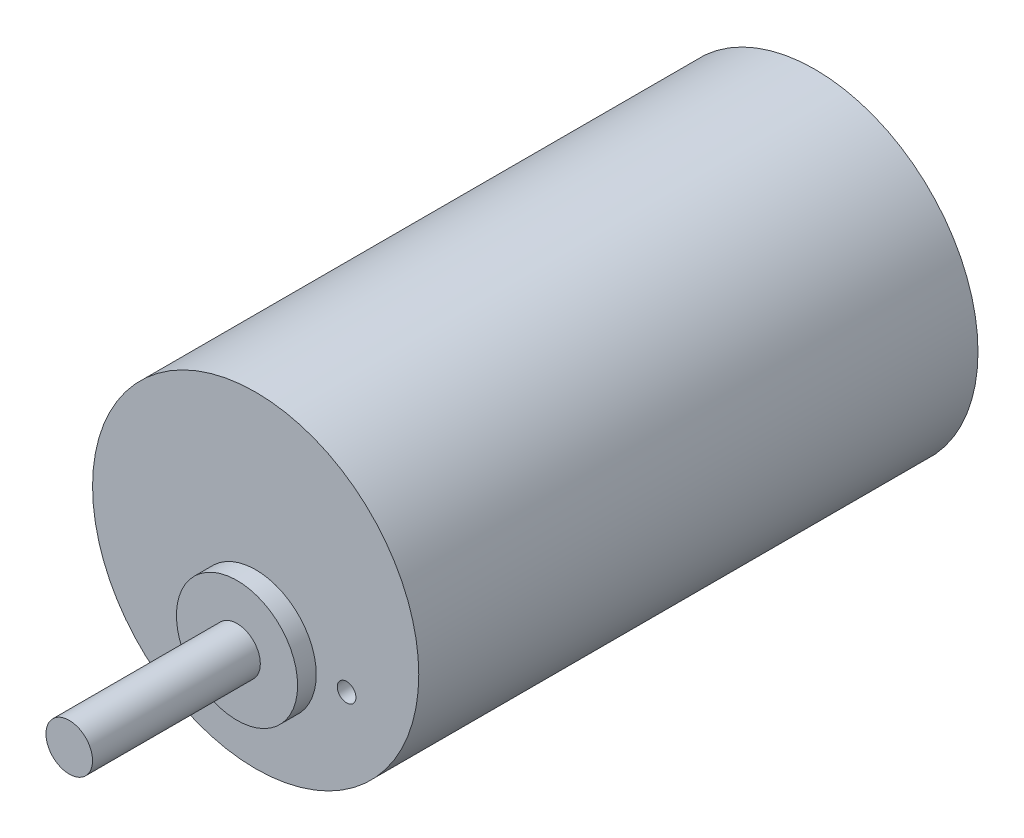
ISO-10303-21;
HEADER;
FILE_DESCRIPTION(('STEP AP214'),'2;1');
FILE_NAME('part.step','',(''),(''),'','','');
FILE_SCHEMA(('AUTOMOTIVE_DESIGN { 1 0 10303 214 1 1 1 1 }'));
ENDSEC;
DATA;
#1=APPLICATION_CONTEXT('core data for automotive mechanical design processes');
#2=APPLICATION_PROTOCOL_DEFINITION('international standard','automotive_design',2000,#1);
#3=PRODUCT_CONTEXT('',#1,'mechanical');
#4=PRODUCT('Part','Part','',(#3));
#5=PRODUCT_RELATED_PRODUCT_CATEGORY('part','',(#4));
#6=PRODUCT_DEFINITION_FORMATION('','',#4);
#7=PRODUCT_DEFINITION_CONTEXT('part definition',#1,'design');
#8=PRODUCT_DEFINITION('design','',#6,#7);
#9=PRODUCT_DEFINITION_SHAPE('','',#8);
#10=(LENGTH_UNIT() NAMED_UNIT(*) SI_UNIT(.MILLI.,.METRE.));
#11=(NAMED_UNIT(*) PLANE_ANGLE_UNIT() SI_UNIT($,.RADIAN.));
#12=(NAMED_UNIT(*) SI_UNIT($,.STERADIAN.) SOLID_ANGLE_UNIT());
#13=UNCERTAINTY_MEASURE_WITH_UNIT(LENGTH_MEASURE(1.E-05),#10,'distance_accuracy_value','');
#14=(GEOMETRIC_REPRESENTATION_CONTEXT(3) GLOBAL_UNCERTAINTY_ASSIGNED_CONTEXT((#13)) GLOBAL_UNIT_ASSIGNED_CONTEXT((#10,
#11,#12)) REPRESENTATION_CONTEXT('',''));
#15=CARTESIAN_POINT('',(0.,0.,0.));
#16=DIRECTION('',(0.,0.,1.));
#17=DIRECTION('',(1.,0.,0.));
#18=AXIS2_PLACEMENT_3D('',#15,#16,#17);
#19=CARTESIAN_POINT('',(0.,0.,60.));
#20=DIRECTION('',(0.,0.,-1.));
#21=DIRECTION('',(-1.,0.,0.));
#22=AXIS2_PLACEMENT_3D('',#19,#20,#21);
#23=CYLINDRICAL_SURFACE('',#22,17.5);
#24=CARTESIAN_POINT('',(0.,0.,60.));
#25=DIRECTION('',(0.,0.,1.));
#26=DIRECTION('',(1.,0.,0.));
#27=AXIS2_PLACEMENT_3D('',#24,#25,#26);
#28=CIRCLE('',#27,17.5);
#29=CARTESIAN_POINT('',(17.5,0.,60.));
#30=VERTEX_POINT('',#29);
#31=EDGE_CURVE('E10',#30,#30,#28,.T.);
#32=ORIENTED_EDGE('',*,*,#31,.F.);
#33=EDGE_LOOP('',(#32));
#34=FACE_BOUND('',#33,.T.);
#35=CARTESIAN_POINT('',(0.,0.,0.));
#36=DIRECTION('',(0.,0.,1.));
#37=DIRECTION('',(1.,0.,0.));
#38=AXIS2_PLACEMENT_3D('',#35,#36,#37);
#39=CIRCLE('',#38,17.5);
#40=CARTESIAN_POINT('',(17.5,0.,0.));
#41=VERTEX_POINT('',#40);
#42=EDGE_CURVE('E37',#41,#41,#39,.T.);
#43=ORIENTED_EDGE('',*,*,#42,.T.);
#44=EDGE_LOOP('',(#43));
#45=FACE_BOUND('',#44,.T.);
#46=ADVANCED_FACE('F30',(#34,#45),#23,.T.);
#47=CARTESIAN_POINT('',(0.,0.,60.));
#48=DIRECTION('',(0.,0.,1.));
#49=DIRECTION('',(1.,0.,0.));
#50=AXIS2_PLACEMENT_3D('',#47,#48,#49);
#51=PLANE('',#50);
#52=CARTESIAN_POINT('',(9.75959379090341,-5.49999999999999,60.));
#53=DIRECTION('',(0.,0.,1.));
#54=DIRECTION('',(1.,0.,0.));
#55=AXIS2_PLACEMENT_3D('',#52,#53,#54);
#56=CIRCLE('',#55,1.);
#57=CARTESIAN_POINT('',(10.7595937909034,-5.49999999999999,60.));
#58=VERTEX_POINT('',#57);
#59=EDGE_CURVE('E53',#58,#58,#56,.T.);
#60=ORIENTED_EDGE('',*,*,#59,.F.);
#61=EDGE_LOOP('',(#60));
#62=FACE_BOUND('',#61,.T.);
#63=CARTESIAN_POINT('',(0.,-5.49999999999999,60.));
#64=DIRECTION('',(0.,0.,1.));
#65=DIRECTION('',(1.,0.,0.));
#66=AXIS2_PLACEMENT_3D('',#63,#64,#65);
#67=CIRCLE('',#66,6.5);
#68=CARTESIAN_POINT('',(6.5,-5.49999999999999,60.));
#69=VERTEX_POINT('',#68);
#70=EDGE_CURVE('E46',#69,#69,#67,.T.);
#71=ORIENTED_EDGE('',*,*,#70,.F.);
#72=EDGE_LOOP('',(#71));
#73=FACE_BOUND('',#72,.T.);
#74=ORIENTED_EDGE('',*,*,#31,.T.);
#75=EDGE_LOOP('',(#74));
#76=FACE_BOUND('',#75,.T.);
#77=ADVANCED_FACE('F68',(#62,#73,#76),#51,.T.);
#78=CARTESIAN_POINT('',(0.,0.,0.));
#79=DIRECTION('',(0.,0.,1.));
#80=DIRECTION('',(1.,0.,0.));
#81=AXIS2_PLACEMENT_3D('',#78,#79,#80);
#82=PLANE('',#81);
#83=ORIENTED_EDGE('',*,*,#42,.F.);
#84=EDGE_LOOP('',(#83));
#85=FACE_BOUND('',#84,.T.);
#86=ADVANCED_FACE('F71',(#85),#82,.F.);
#87=CARTESIAN_POINT('',(0.,-5.49999999999999,62.));
#88=DIRECTION('',(0.,0.,-1.));
#89=DIRECTION('',(-1.,0.,0.));
#90=AXIS2_PLACEMENT_3D('',#87,#88,#89);
#91=CYLINDRICAL_SURFACE('',#90,6.5);
#92=CARTESIAN_POINT('',(0.,-5.49999999999999,62.));
#93=DIRECTION('',(0.,0.,1.));
#94=DIRECTION('',(1.,0.,0.));
#95=AXIS2_PLACEMENT_3D('',#92,#93,#94);
#96=CIRCLE('',#95,6.5);
#97=CARTESIAN_POINT('',(6.5,-5.49999999999999,62.));
#98=VERTEX_POINT('',#97);
#99=EDGE_CURVE('E49',#98,#98,#96,.T.);
#100=ORIENTED_EDGE('',*,*,#99,.F.);
#101=EDGE_LOOP('',(#100));
#102=FACE_BOUND('',#101,.T.);
#103=ORIENTED_EDGE('',*,*,#70,.T.);
#104=EDGE_LOOP('',(#103));
#105=FACE_BOUND('',#104,.T.);
#106=ADVANCED_FACE('F75',(#102,#105),#91,.T.);
#107=CARTESIAN_POINT('',(0.,-5.49999999999999,62.));
#108=DIRECTION('',(0.,0.,1.));
#109=DIRECTION('',(1.,0.,0.));
#110=AXIS2_PLACEMENT_3D('',#107,#108,#109);
#111=PLANE('',#110);
#112=CARTESIAN_POINT('',(0.,-5.49999999999999,62.));
#113=DIRECTION('',(0.,0.,1.));
#114=DIRECTION('',(1.,0.,0.));
#115=AXIS2_PLACEMENT_3D('',#112,#113,#114);
#116=CIRCLE('',#115,2.5);
#117=CARTESIAN_POINT('',(2.5,-5.49999999999999,62.));
#118=VERTEX_POINT('',#117);
#119=EDGE_CURVE('E33',#118,#118,#116,.T.);
#120=ORIENTED_EDGE('',*,*,#119,.F.);
#121=EDGE_LOOP('',(#120));
#122=FACE_BOUND('',#121,.T.);
#123=ORIENTED_EDGE('',*,*,#99,.T.);
#124=EDGE_LOOP('',(#123));
#125=FACE_BOUND('',#124,.T.);
#126=ADVANCED_FACE('F77',(#122,#125),#111,.T.);
#127=CARTESIAN_POINT('',(0.,-5.49999999999999,80.));
#128=DIRECTION('',(0.,0.,1.));
#129=DIRECTION('',(1.,0.,0.));
#130=AXIS2_PLACEMENT_3D('',#127,#128,#129);
#131=PLANE('',#130);
#132=CARTESIAN_POINT('',(0.,-5.49999999999999,80.));
#133=DIRECTION('',(0.,0.,1.));
#134=DIRECTION('',(1.,0.,0.));
#135=AXIS2_PLACEMENT_3D('',#132,#133,#134);
#136=CIRCLE('',#135,2.5);
#137=CARTESIAN_POINT('',(2.5,-5.49999999999999,80.));
#138=VERTEX_POINT('',#137);
#139=EDGE_CURVE('E42',#138,#138,#136,.T.);
#140=ORIENTED_EDGE('',*,*,#139,.T.);
#141=EDGE_LOOP('',(#140));
#142=FACE_BOUND('',#141,.T.);
#143=ADVANCED_FACE('F84',(#142),#131,.T.);
#144=CARTESIAN_POINT('',(0.,-5.49999999999999,80.));
#145=DIRECTION('',(0.,0.,-1.));
#146=DIRECTION('',(-1.,0.,0.));
#147=AXIS2_PLACEMENT_3D('',#144,#145,#146);
#148=CYLINDRICAL_SURFACE('',#147,2.5);
#149=ORIENTED_EDGE('',*,*,#119,.T.);
#150=EDGE_LOOP('',(#149));
#151=FACE_BOUND('',#150,.T.);
#152=ORIENTED_EDGE('',*,*,#139,.F.);
#153=EDGE_LOOP('',(#152));
#154=FACE_BOUND('',#153,.T.);
#155=ADVANCED_FACE('F64',(#151,#154),#148,.T.);
#156=CARTESIAN_POINT('',(9.75959379090341,-5.49999999999999,57.46));
#157=DIRECTION('',(0.,0.,1.));
#158=DIRECTION('',(1.,0.,0.));
#159=AXIS2_PLACEMENT_3D('',#156,#157,#158);
#160=CYLINDRICAL_SURFACE('',#159,1.);
#161=CARTESIAN_POINT('',(9.75959379090341,-5.49999999999999,57.46));
#162=DIRECTION('',(0.,0.,1.));
#163=DIRECTION('',(1.,0.,0.));
#164=AXIS2_PLACEMENT_3D('',#161,#162,#163);
#165=CIRCLE('',#164,1.);
#166=CARTESIAN_POINT('',(10.7595937909034,-5.49999999999999,57.46));
#167=VERTEX_POINT('',#166);
#168=EDGE_CURVE('E50',#167,#167,#165,.T.);
#169=ORIENTED_EDGE('',*,*,#168,.F.);
#170=EDGE_LOOP('',(#169));
#171=FACE_BOUND('',#170,.T.);
#172=ORIENTED_EDGE('',*,*,#59,.T.);
#173=EDGE_LOOP('',(#172));
#174=FACE_BOUND('',#173,.T.);
#175=ADVANCED_FACE('F61',(#171,#174),#160,.F.);
#176=CARTESIAN_POINT('',(9.75959379090341,-5.49999999999999,57.46));
#177=DIRECTION('',(0.,0.,1.));
#178=DIRECTION('',(1.,0.,0.));
#179=AXIS2_PLACEMENT_3D('',#176,#177,#178);
#180=PLANE('',#179);
#181=ORIENTED_EDGE('',*,*,#168,.T.);
#182=EDGE_LOOP('',(#181));
#183=FACE_BOUND('',#182,.T.);
#184=ADVANCED_FACE('F59',(#183),#180,.T.);
#185=CLOSED_SHELL('',(#46,#77,#86,#106,#126,#143,#155,#175,#184));
#186=MANIFOLD_SOLID_BREP('B2',#185);
#187=ADVANCED_BREP_SHAPE_REPRESENTATION('',(#18,#186),#14);
#188=SHAPE_DEFINITION_REPRESENTATION(#9,#187);
ENDSEC;
END-ISO-10303-21;
